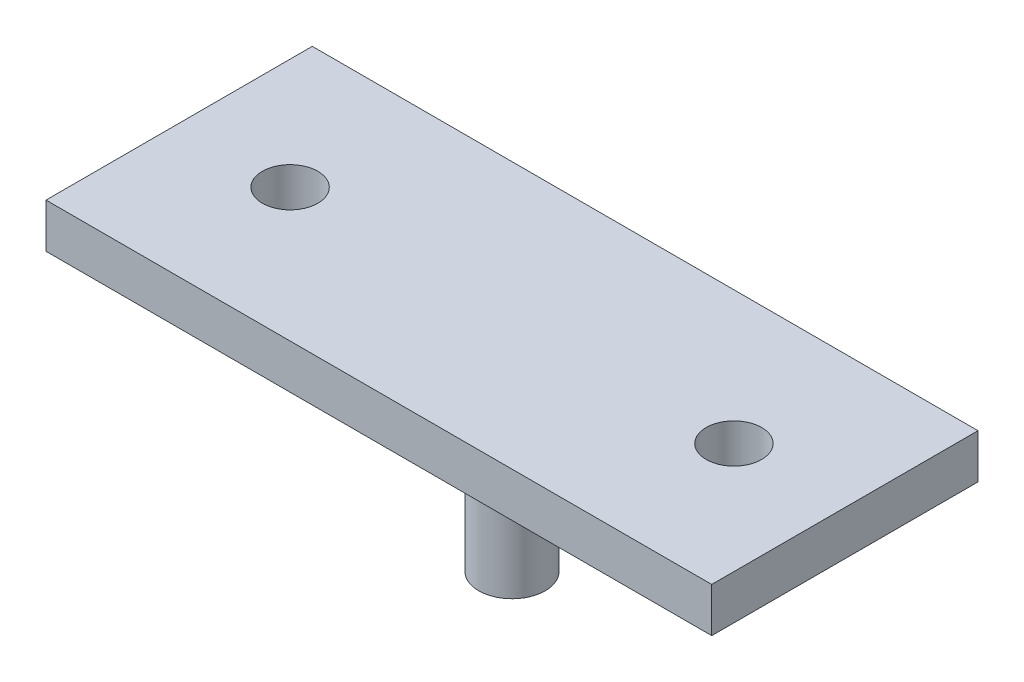
ISO-10303-21;
HEADER;
FILE_DESCRIPTION(('STEP AP214'),'2;1');
FILE_NAME('part.step','',(''),(''),'','','');
FILE_SCHEMA(('AUTOMOTIVE_DESIGN { 1 0 10303 214 1 1 1 1 }'));
ENDSEC;
DATA;
#1=APPLICATION_CONTEXT('core data for automotive mechanical design processes');
#2=APPLICATION_PROTOCOL_DEFINITION('international standard','automotive_design',2000,#1);
#3=PRODUCT_CONTEXT('',#1,'mechanical');
#4=PRODUCT('Part','Part','',(#3));
#5=PRODUCT_RELATED_PRODUCT_CATEGORY('part','',(#4));
#6=PRODUCT_DEFINITION_FORMATION('','',#4);
#7=PRODUCT_DEFINITION_CONTEXT('part definition',#1,'design');
#8=PRODUCT_DEFINITION('design','',#6,#7);
#9=PRODUCT_DEFINITION_SHAPE('','',#8);
#10=(LENGTH_UNIT() NAMED_UNIT(*) SI_UNIT(.MILLI.,.METRE.));
#11=(NAMED_UNIT(*) PLANE_ANGLE_UNIT() SI_UNIT($,.RADIAN.));
#12=(NAMED_UNIT(*) SI_UNIT($,.STERADIAN.) SOLID_ANGLE_UNIT());
#13=UNCERTAINTY_MEASURE_WITH_UNIT(LENGTH_MEASURE(1.E-05),#10,'distance_accuracy_value','');
#14=(GEOMETRIC_REPRESENTATION_CONTEXT(3) GLOBAL_UNCERTAINTY_ASSIGNED_CONTEXT((#13)) GLOBAL_UNIT_ASSIGNED_CONTEXT((#10,
#11,#12)) REPRESENTATION_CONTEXT('',''));
#15=CARTESIAN_POINT('',(0.,0.,0.));
#16=DIRECTION('',(0.,0.,1.));
#17=DIRECTION('',(1.,0.,0.));
#18=AXIS2_PLACEMENT_3D('',#15,#16,#17);
#19=CARTESIAN_POINT('',(0.,2.54,0.));
#20=DIRECTION('',(0.,-1.,0.));
#21=DIRECTION('',(0.,0.,-1.));
#22=AXIS2_PLACEMENT_3D('',#19,#20,#21);
#23=PLANE('',#22);
#24=DIRECTION('',(0.,0.,-1.));
#25=VECTOR('',#24,1.);
#26=CARTESIAN_POINT('',(19.05,2.54,7.62));
#27=LINE('',#26,#25);
#28=CARTESIAN_POINT('',(19.05,2.54,7.62));
#29=VERTEX_POINT('',#28);
#30=CARTESIAN_POINT('',(19.05,2.54,-7.62));
#31=VERTEX_POINT('',#30);
#32=EDGE_CURVE('E91',#29,#31,#27,.T.);
#33=ORIENTED_EDGE('',*,*,#32,.T.);
#34=DIRECTION('',(-1.,0.,0.));
#35=VECTOR('',#34,1.);
#36=CARTESIAN_POINT('',(-19.05,2.54,-7.62));
#37=LINE('',#36,#35);
#38=CARTESIAN_POINT('',(-19.05,2.54,-7.62));
#39=VERTEX_POINT('',#38);
#40=EDGE_CURVE('E86',#31,#39,#37,.T.);
#41=ORIENTED_EDGE('',*,*,#40,.T.);
#42=DIRECTION('',(0.,0.,1.));
#43=VECTOR('',#42,1.);
#44=CARTESIAN_POINT('',(-19.05,2.54,7.62));
#45=LINE('',#44,#43);
#46=CARTESIAN_POINT('',(-19.05,2.54,7.62));
#47=VERTEX_POINT('',#46);
#48=EDGE_CURVE('E89',#39,#47,#45,.T.);
#49=ORIENTED_EDGE('',*,*,#48,.T.);
#50=DIRECTION('',(1.,0.,0.));
#51=VECTOR('',#50,1.);
#52=CARTESIAN_POINT('',(-19.05,2.54,7.62));
#53=LINE('',#52,#51);
#54=EDGE_CURVE('E56',#47,#29,#53,.T.);
#55=ORIENTED_EDGE('',*,*,#54,.T.);
#56=EDGE_LOOP('',(#33,#41,#49,#55));
#57=FACE_BOUND('',#56,.T.);
#58=CARTESIAN_POINT('',(12.7,2.54,0.));
#59=DIRECTION('',(0.,1.,0.));
#60=DIRECTION('',(0.,0.,1.));
#61=AXIS2_PLACEMENT_3D('',#58,#59,#60);
#62=CIRCLE('',#61,1.5875);
#63=CARTESIAN_POINT('',(12.7,2.54,1.5875));
#64=VERTEX_POINT('',#63);
#65=EDGE_CURVE('E106',#64,#64,#62,.T.);
#66=ORIENTED_EDGE('',*,*,#65,.F.);
#67=EDGE_LOOP('',(#66));
#68=FACE_BOUND('',#67,.T.);
#69=CARTESIAN_POINT('',(-12.7,2.54,0.));
#70=DIRECTION('',(0.,1.,0.));
#71=DIRECTION('',(0.,0.,-1.));
#72=AXIS2_PLACEMENT_3D('',#69,#70,#71);
#73=CIRCLE('',#72,1.5875);
#74=CARTESIAN_POINT('',(-12.7,2.54,-1.5875));
#75=VERTEX_POINT('',#74);
#76=EDGE_CURVE('E121',#75,#75,#73,.T.);
#77=ORIENTED_EDGE('',*,*,#76,.F.);
#78=EDGE_LOOP('',(#77));
#79=FACE_BOUND('',#78,.T.);
#80=ADVANCED_FACE('F39',(#57,#68,#79),#23,.F.);
#81=CARTESIAN_POINT('',(0.,0.,0.));
#82=DIRECTION('',(0.,-1.,0.));
#83=DIRECTION('',(0.,0.,-1.));
#84=AXIS2_PLACEMENT_3D('',#81,#82,#83);
#85=PLANE('',#84);
#86=CARTESIAN_POINT('',(0.,0.,0.));
#87=DIRECTION('',(0.,-1.,0.));
#88=DIRECTION('',(0.,0.,-1.));
#89=AXIS2_PLACEMENT_3D('',#86,#87,#88);
#90=CIRCLE('',#89,1.905);
#91=CARTESIAN_POINT('',(0.,0.,-1.905));
#92=VERTEX_POINT('',#91);
#93=EDGE_CURVE('E130',#92,#92,#90,.T.);
#94=ORIENTED_EDGE('',*,*,#93,.F.);
#95=EDGE_LOOP('',(#94));
#96=FACE_BOUND('',#95,.T.);
#97=CARTESIAN_POINT('',(12.7,0.,0.));
#98=DIRECTION('',(0.,1.,0.));
#99=DIRECTION('',(0.,0.,1.));
#100=AXIS2_PLACEMENT_3D('',#97,#98,#99);
#101=CIRCLE('',#100,1.5875);
#102=CARTESIAN_POINT('',(12.7,0.,1.5875));
#103=VERTEX_POINT('',#102);
#104=EDGE_CURVE('E118',#103,#103,#101,.T.);
#105=ORIENTED_EDGE('',*,*,#104,.T.);
#106=EDGE_LOOP('',(#105));
#107=FACE_BOUND('',#106,.T.);
#108=DIRECTION('',(0.,0.,-1.));
#109=VECTOR('',#108,1.);
#110=CARTESIAN_POINT('',(19.05,0.,7.62));
#111=LINE('',#110,#109);
#112=CARTESIAN_POINT('',(19.05,0.,7.62));
#113=VERTEX_POINT('',#112);
#114=CARTESIAN_POINT('',(19.05,0.,-7.62));
#115=VERTEX_POINT('',#114);
#116=EDGE_CURVE('E103',#113,#115,#111,.T.);
#117=ORIENTED_EDGE('',*,*,#116,.F.);
#118=DIRECTION('',(1.,0.,0.));
#119=VECTOR('',#118,1.);
#120=CARTESIAN_POINT('',(-19.05,0.,7.62));
#121=LINE('',#120,#119);
#122=CARTESIAN_POINT('',(-19.05,0.,7.62));
#123=VERTEX_POINT('',#122);
#124=EDGE_CURVE('E79',#123,#113,#121,.T.);
#125=ORIENTED_EDGE('',*,*,#124,.F.);
#126=DIRECTION('',(0.,0.,1.));
#127=VECTOR('',#126,1.);
#128=CARTESIAN_POINT('',(-19.05,0.,7.62));
#129=LINE('',#128,#127);
#130=CARTESIAN_POINT('',(-19.05,0.,-7.62));
#131=VERTEX_POINT('',#130);
#132=EDGE_CURVE('E73',#131,#123,#129,.T.);
#133=ORIENTED_EDGE('',*,*,#132,.F.);
#134=DIRECTION('',(-1.,0.,0.));
#135=VECTOR('',#134,1.);
#136=CARTESIAN_POINT('',(-19.05,0.,-7.62));
#137=LINE('',#136,#135);
#138=EDGE_CURVE('E95',#115,#131,#137,.T.);
#139=ORIENTED_EDGE('',*,*,#138,.F.);
#140=EDGE_LOOP('',(#117,#125,#133,#139));
#141=FACE_BOUND('',#140,.T.);
#142=CARTESIAN_POINT('',(-12.7,0.,0.));
#143=DIRECTION('',(0.,1.,0.));
#144=DIRECTION('',(0.,0.,-1.));
#145=AXIS2_PLACEMENT_3D('',#142,#143,#144);
#146=CIRCLE('',#145,1.5875);
#147=CARTESIAN_POINT('',(-12.7,0.,-1.5875));
#148=VERTEX_POINT('',#147);
#149=EDGE_CURVE('E124',#148,#148,#146,.T.);
#150=ORIENTED_EDGE('',*,*,#149,.T.);
#151=EDGE_LOOP('',(#150));
#152=FACE_BOUND('',#151,.T.);
#153=ADVANCED_FACE('F114',(#96,#107,#141,#152),#85,.T.);
#154=CARTESIAN_POINT('',(19.05,2.54,7.62));
#155=DIRECTION('',(-1.,0.,0.));
#156=DIRECTION('',(0.,0.,1.));
#157=AXIS2_PLACEMENT_3D('',#154,#155,#156);
#158=PLANE('',#157);
#159=ORIENTED_EDGE('',*,*,#116,.T.);
#160=DIRECTION('',(0.,-1.,0.));
#161=VECTOR('',#160,1.);
#162=CARTESIAN_POINT('',(19.05,2.54,-7.62));
#163=LINE('',#162,#161);
#164=EDGE_CURVE('E11',#31,#115,#163,.T.);
#165=ORIENTED_EDGE('',*,*,#164,.F.);
#166=ORIENTED_EDGE('',*,*,#32,.F.);
#167=DIRECTION('',(0.,-1.,0.));
#168=VECTOR('',#167,1.);
#169=CARTESIAN_POINT('',(19.05,2.54,7.62));
#170=LINE('',#169,#168);
#171=EDGE_CURVE('E99',#29,#113,#170,.T.);
#172=ORIENTED_EDGE('',*,*,#171,.T.);
#173=EDGE_LOOP('',(#159,#165,#166,#172));
#174=FACE_BOUND('',#173,.T.);
#175=ADVANCED_FACE('F41',(#174),#158,.F.);
#176=CARTESIAN_POINT('',(-19.05,2.54,-7.62));
#177=DIRECTION('',(0.,0.,1.));
#178=DIRECTION('',(1.,0.,0.));
#179=AXIS2_PLACEMENT_3D('',#176,#177,#178);
#180=PLANE('',#179);
#181=ORIENTED_EDGE('',*,*,#138,.T.);
#182=DIRECTION('',(0.,-1.,0.));
#183=VECTOR('',#182,1.);
#184=CARTESIAN_POINT('',(-19.05,2.54,-7.62));
#185=LINE('',#184,#183);
#186=EDGE_CURVE('E48',#39,#131,#185,.T.);
#187=ORIENTED_EDGE('',*,*,#186,.F.);
#188=ORIENTED_EDGE('',*,*,#40,.F.);
#189=ORIENTED_EDGE('',*,*,#164,.T.);
#190=EDGE_LOOP('',(#181,#187,#188,#189));
#191=FACE_BOUND('',#190,.T.);
#192=ADVANCED_FACE('F94',(#191),#180,.F.);
#193=CARTESIAN_POINT('',(-19.05,2.54,7.62));
#194=DIRECTION('',(1.,0.,0.));
#195=DIRECTION('',(0.,0.,-1.));
#196=AXIS2_PLACEMENT_3D('',#193,#194,#195);
#197=PLANE('',#196);
#198=ORIENTED_EDGE('',*,*,#132,.T.);
#199=DIRECTION('',(0.,-1.,0.));
#200=VECTOR('',#199,1.);
#201=CARTESIAN_POINT('',(-19.05,2.54,7.62));
#202=LINE('',#201,#200);
#203=EDGE_CURVE('E96',#47,#123,#202,.T.);
#204=ORIENTED_EDGE('',*,*,#203,.F.);
#205=ORIENTED_EDGE('',*,*,#48,.F.);
#206=ORIENTED_EDGE('',*,*,#186,.T.);
#207=EDGE_LOOP('',(#198,#204,#205,#206));
#208=FACE_BOUND('',#207,.T.);
#209=ADVANCED_FACE('F97',(#208),#197,.F.);
#210=CARTESIAN_POINT('',(-19.05,2.54,7.62));
#211=DIRECTION('',(0.,0.,-1.));
#212=DIRECTION('',(-1.,0.,0.));
#213=AXIS2_PLACEMENT_3D('',#210,#211,#212);
#214=PLANE('',#213);
#215=ORIENTED_EDGE('',*,*,#124,.T.);
#216=ORIENTED_EDGE('',*,*,#171,.F.);
#217=ORIENTED_EDGE('',*,*,#54,.F.);
#218=ORIENTED_EDGE('',*,*,#203,.T.);
#219=EDGE_LOOP('',(#215,#216,#217,#218));
#220=FACE_BOUND('',#219,.T.);
#221=ADVANCED_FACE('F111',(#220),#214,.F.);
#222=CARTESIAN_POINT('',(12.7,2.54,0.));
#223=DIRECTION('',(0.,-1.,0.));
#224=DIRECTION('',(0.,0.,-1.));
#225=AXIS2_PLACEMENT_3D('',#222,#223,#224);
#226=CYLINDRICAL_SURFACE('',#225,1.5875);
#227=ORIENTED_EDGE('',*,*,#65,.T.);
#228=EDGE_LOOP('',(#227));
#229=FACE_BOUND('',#228,.T.);
#230=ORIENTED_EDGE('',*,*,#104,.F.);
#231=EDGE_LOOP('',(#230));
#232=FACE_BOUND('',#231,.T.);
#233=ADVANCED_FACE('F150',(#229,#232),#226,.F.);
#234=CARTESIAN_POINT('',(-12.7,2.54,0.));
#235=DIRECTION('',(0.,-1.,0.));
#236=DIRECTION('',(0.,0.,-1.));
#237=AXIS2_PLACEMENT_3D('',#234,#235,#236);
#238=CYLINDRICAL_SURFACE('',#237,1.5875);
#239=ORIENTED_EDGE('',*,*,#76,.T.);
#240=EDGE_LOOP('',(#239));
#241=FACE_BOUND('',#240,.T.);
#242=ORIENTED_EDGE('',*,*,#149,.F.);
#243=EDGE_LOOP('',(#242));
#244=FACE_BOUND('',#243,.T.);
#245=ADVANCED_FACE('F141',(#241,#244),#238,.F.);
#246=CARTESIAN_POINT('',(0.,-10.16,0.));
#247=DIRECTION('',(0.,1.,0.));
#248=DIRECTION('',(0.,0.,1.));
#249=AXIS2_PLACEMENT_3D('',#246,#247,#248);
#250=CYLINDRICAL_SURFACE('',#249,1.905);
#251=CARTESIAN_POINT('',(0.,-10.16,0.));
#252=DIRECTION('',(0.,-1.,0.));
#253=DIRECTION('',(0.,0.,-1.));
#254=AXIS2_PLACEMENT_3D('',#251,#252,#253);
#255=CIRCLE('',#254,1.905);
#256=CARTESIAN_POINT('',(0.,-10.16,-1.905));
#257=VERTEX_POINT('',#256);
#258=EDGE_CURVE('E127',#257,#257,#255,.T.);
#259=ORIENTED_EDGE('',*,*,#258,.F.);
#260=EDGE_LOOP('',(#259));
#261=FACE_BOUND('',#260,.T.);
#262=ORIENTED_EDGE('',*,*,#93,.T.);
#263=EDGE_LOOP('',(#262));
#264=FACE_BOUND('',#263,.T.);
#265=ADVANCED_FACE('F138',(#261,#264),#250,.T.);
#266=CARTESIAN_POINT('',(0.,-10.16,0.));
#267=DIRECTION('',(0.,-1.,0.));
#268=DIRECTION('',(0.,0.,-1.));
#269=AXIS2_PLACEMENT_3D('',#266,#267,#268);
#270=PLANE('',#269);
#271=ORIENTED_EDGE('',*,*,#258,.T.);
#272=EDGE_LOOP('',(#271));
#273=FACE_BOUND('',#272,.T.);
#274=ADVANCED_FACE('F136',(#273),#270,.T.);
#275=CLOSED_SHELL('',(#80,#153,#175,#192,#209,#221,#233,#245,#265,#274));
#276=MANIFOLD_SOLID_BREP('B2',#275);
#277=ADVANCED_BREP_SHAPE_REPRESENTATION('',(#18,#276),#14);
#278=SHAPE_DEFINITION_REPRESENTATION(#9,#277);
ENDSEC;
END-ISO-10303-21;
